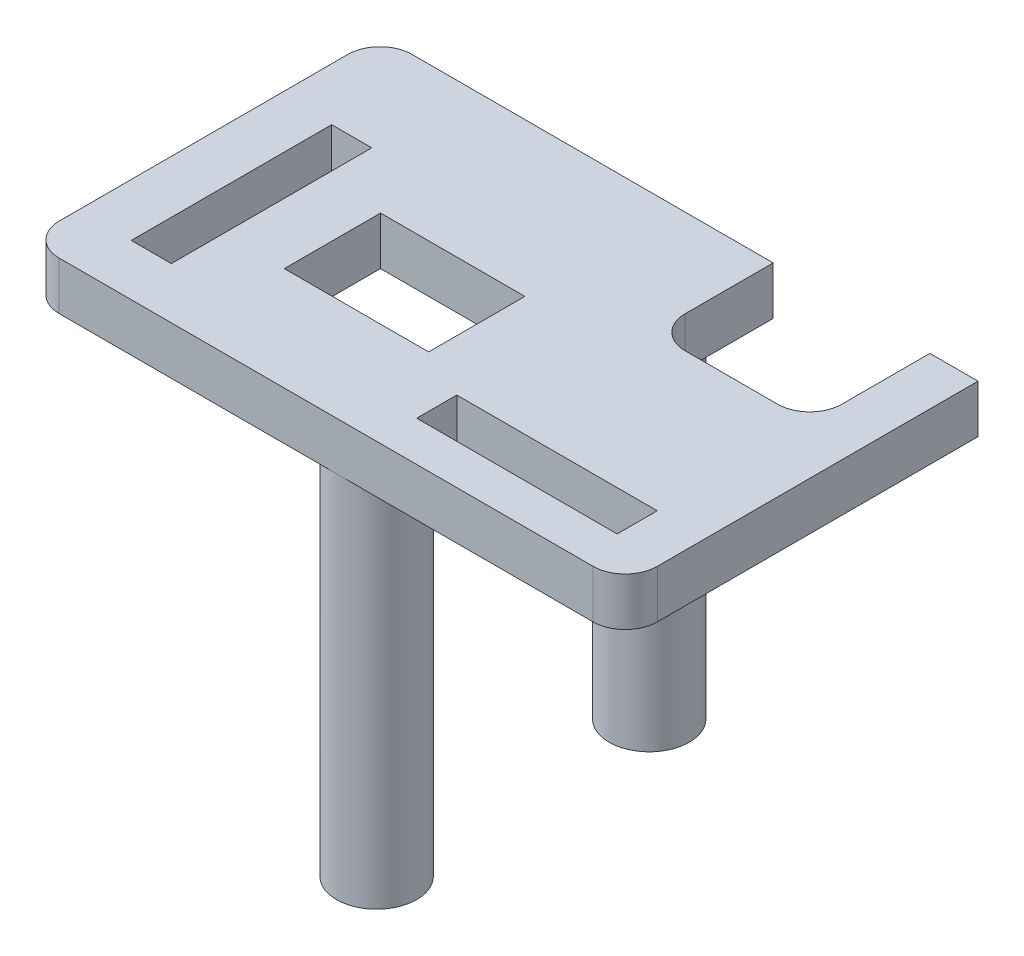
ISO-10303-21;
HEADER;
FILE_DESCRIPTION(('STEP AP214'),'2;1');
FILE_NAME('part.step','',(''),(''),'','','');
FILE_SCHEMA(('AUTOMOTIVE_DESIGN { 1 0 10303 214 1 1 1 1 }'));
ENDSEC;
DATA;
#1=APPLICATION_CONTEXT('core data for automotive mechanical design processes');
#2=APPLICATION_PROTOCOL_DEFINITION('international standard','automotive_design',2000,#1);
#3=PRODUCT_CONTEXT('',#1,'mechanical');
#4=PRODUCT('Part','Part','',(#3));
#5=PRODUCT_RELATED_PRODUCT_CATEGORY('part','',(#4));
#6=PRODUCT_DEFINITION_FORMATION('','',#4);
#7=PRODUCT_DEFINITION_CONTEXT('part definition',#1,'design');
#8=PRODUCT_DEFINITION('design','',#6,#7);
#9=PRODUCT_DEFINITION_SHAPE('','',#8);
#10=(LENGTH_UNIT() NAMED_UNIT(*) SI_UNIT(.MILLI.,.METRE.));
#11=(NAMED_UNIT(*) PLANE_ANGLE_UNIT() SI_UNIT($,.RADIAN.));
#12=(NAMED_UNIT(*) SI_UNIT($,.STERADIAN.) SOLID_ANGLE_UNIT());
#13=UNCERTAINTY_MEASURE_WITH_UNIT(LENGTH_MEASURE(1.E-05),#10,'distance_accuracy_value','');
#14=(GEOMETRIC_REPRESENTATION_CONTEXT(3) GLOBAL_UNCERTAINTY_ASSIGNED_CONTEXT((#13)) GLOBAL_UNIT_ASSIGNED_CONTEXT((#10,
#11,#12)) REPRESENTATION_CONTEXT('',''));
#15=CARTESIAN_POINT('',(0.,0.,0.));
#16=DIRECTION('',(0.,0.,1.));
#17=DIRECTION('',(1.,0.,0.));
#18=AXIS2_PLACEMENT_3D('',#15,#16,#17);
#19=CARTESIAN_POINT('',(-19.9759075065072,3.,0.));
#20=DIRECTION('',(-1.,0.,0.));
#21=DIRECTION('',(0.,0.,1.));
#22=AXIS2_PLACEMENT_3D('',#19,#20,#21);
#23=PLANE('',#22);
#24=DIRECTION('',(0.,0.,-1.));
#25=VECTOR('',#24,1.);
#26=CARTESIAN_POINT('',(-19.9759075065072,0.,0.));
#27=LINE('',#26,#25);
#28=CARTESIAN_POINT('',(-19.9759075065072,0.,28.1900374848538));
#29=VERTEX_POINT('',#28);
#30=CARTESIAN_POINT('',(-19.9759075065072,0.,22.1900374848537));
#31=VERTEX_POINT('',#30);
#32=EDGE_CURVE('E287',#29,#31,#27,.T.);
#33=ORIENTED_EDGE('',*,*,#32,.F.);
#34=DIRECTION('',(0.,-1.,0.));
#35=VECTOR('',#34,1.);
#36=CARTESIAN_POINT('',(-19.9759075065072,3.,28.1900374848538));
#37=LINE('',#36,#35);
#38=CARTESIAN_POINT('',(-19.9759075065072,3.,28.1900374848538));
#39=VERTEX_POINT('',#38);
#40=EDGE_CURVE('E308',#39,#29,#37,.T.);
#41=ORIENTED_EDGE('',*,*,#40,.F.);
#42=DIRECTION('',(0.,0.,-1.));
#43=VECTOR('',#42,1.);
#44=CARTESIAN_POINT('',(-19.9759075065072,3.,0.));
#45=LINE('',#44,#43);
#46=CARTESIAN_POINT('',(-19.9759075065072,3.,22.1900374848537));
#47=VERTEX_POINT('',#46);
#48=EDGE_CURVE('E450',#39,#47,#45,.T.);
#49=ORIENTED_EDGE('',*,*,#48,.T.);
#50=DIRECTION('',(0.,-1.,0.));
#51=VECTOR('',#50,1.);
#52=CARTESIAN_POINT('',(-19.9759075065072,3.,22.1900374848537));
#53=LINE('',#52,#51);
#54=EDGE_CURVE('E300',#47,#31,#53,.T.);
#55=ORIENTED_EDGE('',*,*,#54,.T.);
#56=EDGE_LOOP('',(#33,#41,#49,#55));
#57=FACE_BOUND('',#56,.T.);
#58=ADVANCED_FACE('F34',(#57),#23,.T.);
#59=CARTESIAN_POINT('',(0.,3.,28.1900374848538));
#60=DIRECTION('',(0.,0.,-1.));
#61=DIRECTION('',(-1.,0.,0.));
#62=AXIS2_PLACEMENT_3D('',#59,#60,#61);
#63=PLANE('',#62);
#64=DIRECTION('',(1.,0.,0.));
#65=VECTOR('',#64,1.);
#66=CARTESIAN_POINT('',(0.,0.,28.1900374848538));
#67=LINE('',#66,#65);
#68=CARTESIAN_POINT('',(-28.9759075065072,0.,28.1900374848537));
#69=VERTEX_POINT('',#68);
#70=EDGE_CURVE('E290',#69,#29,#67,.T.);
#71=ORIENTED_EDGE('',*,*,#70,.F.);
#72=DIRECTION('',(0.,-1.,0.));
#73=VECTOR('',#72,1.);
#74=CARTESIAN_POINT('',(-28.9759075065072,3.,28.1900374848537));
#75=LINE('',#74,#73);
#76=CARTESIAN_POINT('',(-28.9759075065072,3.,28.1900374848537));
#77=VERTEX_POINT('',#76);
#78=EDGE_CURVE('E306',#77,#69,#75,.T.);
#79=ORIENTED_EDGE('',*,*,#78,.F.);
#80=DIRECTION('',(1.,0.,0.));
#81=VECTOR('',#80,1.);
#82=CARTESIAN_POINT('',(0.,3.,28.1900374848538));
#83=LINE('',#82,#81);
#84=EDGE_CURVE('E453',#77,#39,#83,.T.);
#85=ORIENTED_EDGE('',*,*,#84,.T.);
#86=ORIENTED_EDGE('',*,*,#40,.T.);
#87=EDGE_LOOP('',(#71,#79,#85,#86));
#88=FACE_BOUND('',#87,.T.);
#89=ADVANCED_FACE('F469',(#88),#63,.T.);
#90=CARTESIAN_POINT('',(-28.9759075065072,3.,0.));
#91=DIRECTION('',(-1.,0.,0.));
#92=DIRECTION('',(0.,0.,1.));
#93=AXIS2_PLACEMENT_3D('',#90,#91,#92);
#94=PLANE('',#93);
#95=DIRECTION('',(0.,0.,-1.));
#96=VECTOR('',#95,1.);
#97=CARTESIAN_POINT('',(-28.9759075065072,0.,0.));
#98=LINE('',#97,#96);
#99=CARTESIAN_POINT('',(-28.9759075065072,0.,22.1900374848537));
#100=VERTEX_POINT('',#99);
#101=EDGE_CURVE('E293',#69,#100,#98,.T.);
#102=ORIENTED_EDGE('',*,*,#101,.T.);
#103=DIRECTION('',(0.,-1.,0.));
#104=VECTOR('',#103,1.);
#105=CARTESIAN_POINT('',(-28.9759075065072,3.,22.1900374848537));
#106=LINE('',#105,#104);
#107=CARTESIAN_POINT('',(-28.9759075065072,3.,22.1900374848537));
#108=VERTEX_POINT('',#107);
#109=EDGE_CURVE('E302',#108,#100,#106,.T.);
#110=ORIENTED_EDGE('',*,*,#109,.F.);
#111=DIRECTION('',(0.,0.,-1.));
#112=VECTOR('',#111,1.);
#113=CARTESIAN_POINT('',(-28.9759075065072,3.,0.));
#114=LINE('',#113,#112);
#115=EDGE_CURVE('E455',#77,#108,#114,.T.);
#116=ORIENTED_EDGE('',*,*,#115,.F.);
#117=ORIENTED_EDGE('',*,*,#78,.T.);
#118=EDGE_LOOP('',(#102,#110,#116,#117));
#119=FACE_BOUND('',#118,.T.);
#120=ADVANCED_FACE('F472',(#119),#94,.F.);
#121=CARTESIAN_POINT('',(0.,3.,18.9400374848537));
#122=DIRECTION('',(0.,0.,-1.));
#123=DIRECTION('',(-1.,0.,0.));
#124=AXIS2_PLACEMENT_3D('',#121,#122,#123);
#125=PLANE('',#124);
#126=DIRECTION('',(1.,0.,0.));
#127=VECTOR('',#126,1.);
#128=CARTESIAN_POINT('',(0.,0.,18.9400374848537));
#129=LINE('',#128,#127);
#130=CARTESIAN_POINT('',(-35.2702207310731,0.,18.9400374848537));
#131=VERTEX_POINT('',#130);
#132=CARTESIAN_POINT('',(-32.7702207310731,0.,18.9400374848537));
#133=VERTEX_POINT('',#132);
#134=EDGE_CURVE('E275',#131,#133,#129,.T.);
#135=ORIENTED_EDGE('',*,*,#134,.T.);
#136=DIRECTION('',(0.,-1.,0.));
#137=VECTOR('',#136,1.);
#138=CARTESIAN_POINT('',(-32.7702207310731,3.,18.9400374848537));
#139=LINE('',#138,#137);
#140=CARTESIAN_POINT('',(-32.7702207310731,3.,18.9400374848537));
#141=VERTEX_POINT('',#140);
#142=EDGE_CURVE('E303',#141,#133,#139,.T.);
#143=ORIENTED_EDGE('',*,*,#142,.F.);
#144=DIRECTION('',(1.,0.,0.));
#145=VECTOR('',#144,1.);
#146=CARTESIAN_POINT('',(0.,3.,18.9400374848537));
#147=LINE('',#146,#145);
#148=CARTESIAN_POINT('',(-35.2702207310731,3.,18.9400374848537));
#149=VERTEX_POINT('',#148);
#150=EDGE_CURVE('E389',#149,#141,#147,.T.);
#151=ORIENTED_EDGE('',*,*,#150,.F.);
#152=DIRECTION('',(0.,-1.,0.));
#153=VECTOR('',#152,1.);
#154=CARTESIAN_POINT('',(-35.2702207310731,3.,18.9400374848537));
#155=LINE('',#154,#153);
#156=EDGE_CURVE('E311',#149,#131,#155,.T.);
#157=ORIENTED_EDGE('',*,*,#156,.T.);
#158=EDGE_LOOP('',(#135,#143,#151,#157));
#159=FACE_BOUND('',#158,.T.);
#160=ADVANCED_FACE('F505',(#159),#125,.F.);
#161=CARTESIAN_POINT('',(-32.7702207310731,3.,0.));
#162=DIRECTION('',(1.,0.,0.));
#163=DIRECTION('',(0.,0.,-1.));
#164=AXIS2_PLACEMENT_3D('',#161,#162,#163);
#165=PLANE('',#164);
#166=DIRECTION('',(0.,0.,1.));
#167=VECTOR('',#166,1.);
#168=CARTESIAN_POINT('',(-32.7702207310731,0.,0.));
#169=LINE('',#168,#167);
#170=CARTESIAN_POINT('',(-32.7702207310731,0.,31.4400374848537));
#171=VERTEX_POINT('',#170);
#172=EDGE_CURVE('E278',#133,#171,#169,.T.);
#173=ORIENTED_EDGE('',*,*,#172,.T.);
#174=DIRECTION('',(0.,-1.,0.));
#175=VECTOR('',#174,1.);
#176=CARTESIAN_POINT('',(-32.7702207310731,3.,31.4400374848537));
#177=LINE('',#176,#175);
#178=CARTESIAN_POINT('',(-32.7702207310731,3.,31.4400374848537));
#179=VERTEX_POINT('',#178);
#180=EDGE_CURVE('E316',#179,#171,#177,.T.);
#181=ORIENTED_EDGE('',*,*,#180,.F.);
#182=DIRECTION('',(0.,0.,1.));
#183=VECTOR('',#182,1.);
#184=CARTESIAN_POINT('',(-32.7702207310731,3.,0.));
#185=LINE('',#184,#183);
#186=EDGE_CURVE('E442',#141,#179,#185,.T.);
#187=ORIENTED_EDGE('',*,*,#186,.F.);
#188=ORIENTED_EDGE('',*,*,#142,.T.);
#189=EDGE_LOOP('',(#173,#181,#187,#188));
#190=FACE_BOUND('',#189,.T.);
#191=ADVANCED_FACE('F501',(#190),#165,.F.);
#192=CARTESIAN_POINT('',(0.,3.,31.4400374848537));
#193=DIRECTION('',(0.,0.,-1.));
#194=DIRECTION('',(-1.,0.,0.));
#195=AXIS2_PLACEMENT_3D('',#192,#193,#194);
#196=PLANE('',#195);
#197=DIRECTION('',(1.,0.,0.));
#198=VECTOR('',#197,1.);
#199=CARTESIAN_POINT('',(0.,0.,31.4400374848537));
#200=LINE('',#199,#198);
#201=CARTESIAN_POINT('',(-35.2702207310731,0.,31.4400374848537));
#202=VERTEX_POINT('',#201);
#203=EDGE_CURVE('E281',#202,#171,#200,.T.);
#204=ORIENTED_EDGE('',*,*,#203,.F.);
#205=DIRECTION('',(0.,-1.,0.));
#206=VECTOR('',#205,1.);
#207=CARTESIAN_POINT('',(-35.2702207310731,3.,31.4400374848537));
#208=LINE('',#207,#206);
#209=CARTESIAN_POINT('',(-35.2702207310731,3.,31.4400374848537));
#210=VERTEX_POINT('',#209);
#211=EDGE_CURVE('E313',#210,#202,#208,.T.);
#212=ORIENTED_EDGE('',*,*,#211,.F.);
#213=DIRECTION('',(1.,0.,0.));
#214=VECTOR('',#213,1.);
#215=CARTESIAN_POINT('',(0.,3.,31.4400374848537));
#216=LINE('',#215,#214);
#217=EDGE_CURVE('E444',#210,#179,#216,.T.);
#218=ORIENTED_EDGE('',*,*,#217,.T.);
#219=ORIENTED_EDGE('',*,*,#180,.T.);
#220=EDGE_LOOP('',(#204,#212,#218,#219));
#221=FACE_BOUND('',#220,.T.);
#222=ADVANCED_FACE('F497',(#221),#196,.T.);
#223=CARTESIAN_POINT('',(0.,3.,12.6400374848537));
#224=DIRECTION('',(0.,0.,-1.));
#225=DIRECTION('',(-1.,0.,0.));
#226=AXIS2_PLACEMENT_3D('',#223,#224,#225);
#227=PLANE('',#226);
#228=DIRECTION('',(1.,0.,0.));
#229=VECTOR('',#228,1.);
#230=CARTESIAN_POINT('',(0.,0.,12.6400374848537));
#231=LINE('',#230,#229);
#232=CARTESIAN_POINT('',(-36.561763485987,0.,12.6400374848537));
#233=VERTEX_POINT('',#232);
#234=CARTESIAN_POINT('',(-19.2702207310731,0.,12.6400374848537));
#235=VERTEX_POINT('',#234);
#236=EDGE_CURVE('E253',#233,#235,#231,.T.);
#237=ORIENTED_EDGE('',*,*,#236,.F.);
#238=DIRECTION('',(0.,-1.,0.));
#239=VECTOR('',#238,1.);
#240=CARTESIAN_POINT('',(-36.561763485987,3.,12.6400374848537));
#241=LINE('',#240,#239);
#242=CARTESIAN_POINT('',(-36.561763485987,3.,12.6400374848537));
#243=VERTEX_POINT('',#242);
#244=EDGE_CURVE('E350',#233,#243,#241,.F.);
#245=ORIENTED_EDGE('',*,*,#244,.T.);
#246=DIRECTION('',(1.,0.,0.));
#247=VECTOR('',#246,1.);
#248=CARTESIAN_POINT('',(0.,3.,12.6400374848537));
#249=LINE('',#248,#247);
#250=CARTESIAN_POINT('',(-14.0414444487504,3.,12.6400374848537));
#251=VERTEX_POINT('',#250);
#252=EDGE_CURVE('E433',#243,#251,#249,.T.);
#253=ORIENTED_EDGE('',*,*,#252,.T.);
#254=DIRECTION('',(0.,-1.,0.));
#255=VECTOR('',#254,1.);
#256=CARTESIAN_POINT('',(-14.0414444487504,3.,12.6400374848537));
#257=LINE('',#256,#255);
#258=CARTESIAN_POINT('',(-14.0414444487504,0.,12.6400374848537));
#259=VERTEX_POINT('',#258);
#260=EDGE_CURVE('E232',#251,#259,#257,.T.);
#261=ORIENTED_EDGE('',*,*,#260,.T.);
#262=EDGE_CURVE('E252',#235,#259,#231,.T.);
#263=ORIENTED_EDGE('',*,*,#262,.F.);
#264=EDGE_LOOP('',(#237,#245,#253,#261,#263));
#265=FACE_BOUND('',#264,.T.);
#266=ADVANCED_FACE('F500',(#265),#227,.T.);
#267=CARTESIAN_POINT('',(-38.561763485987,3.,0.));
#268=DIRECTION('',(1.,0.,0.));
#269=DIRECTION('',(0.,0.,-1.));
#270=AXIS2_PLACEMENT_3D('',#267,#268,#269);
#271=PLANE('',#270);
#272=DIRECTION('',(0.,0.,1.));
#273=VECTOR('',#272,1.);
#274=CARTESIAN_POINT('',(-38.561763485987,3.,0.));
#275=LINE('',#274,#273);
#276=CARTESIAN_POINT('',(-38.561763485987,3.,14.6400374848537));
#277=VERTEX_POINT('',#276);
#278=CARTESIAN_POINT('',(-38.561763485987,3.,32.6400374848537));
#279=VERTEX_POINT('',#278);
#280=EDGE_CURVE('E429',#277,#279,#275,.T.);
#281=ORIENTED_EDGE('',*,*,#280,.F.);
#282=DIRECTION('',(0.,-1.,0.));
#283=VECTOR('',#282,1.);
#284=CARTESIAN_POINT('',(-38.561763485987,0.,14.6400374848537));
#285=LINE('',#284,#283);
#286=CARTESIAN_POINT('',(-38.561763485987,0.,14.6400374848537));
#287=VERTEX_POINT('',#286);
#288=EDGE_CURVE('E341',#277,#287,#285,.T.);
#289=ORIENTED_EDGE('',*,*,#288,.T.);
#290=DIRECTION('',(0.,0.,1.));
#291=VECTOR('',#290,1.);
#292=CARTESIAN_POINT('',(-38.561763485987,0.,0.));
#293=LINE('',#292,#291);
#294=CARTESIAN_POINT('',(-38.561763485987,0.,32.6400374848537));
#295=VERTEX_POINT('',#294);
#296=EDGE_CURVE('E256',#287,#295,#293,.T.);
#297=ORIENTED_EDGE('',*,*,#296,.T.);
#298=DIRECTION('',(0.,-1.,0.));
#299=VECTOR('',#298,1.);
#300=CARTESIAN_POINT('',(-38.561763485987,3.,32.6400374848537));
#301=LINE('',#300,#299);
#302=EDGE_CURVE('E339',#295,#279,#301,.F.);
#303=ORIENTED_EDGE('',*,*,#302,.T.);
#304=EDGE_LOOP('',(#281,#289,#297,#303));
#305=FACE_BOUND('',#304,.T.);
#306=ADVANCED_FACE('F523',(#305),#271,.F.);
#307=CARTESIAN_POINT('',(0.,3.,34.6400374848537));
#308=DIRECTION('',(0.,0.,-1.));
#309=DIRECTION('',(-1.,0.,0.));
#310=AXIS2_PLACEMENT_3D('',#307,#308,#309);
#311=PLANE('',#310);
#312=DIRECTION('',(1.,0.,0.));
#313=VECTOR('',#312,1.);
#314=CARTESIAN_POINT('',(0.,3.,34.6400374848537));
#315=LINE('',#314,#313);
#316=CARTESIAN_POINT('',(-36.561763485987,3.,34.6400374848537));
#317=VERTEX_POINT('',#316);
#318=CARTESIAN_POINT('',(-3.2702207310731,3.,34.6400374848537));
#319=VERTEX_POINT('',#318);
#320=EDGE_CURVE('E425',#317,#319,#315,.T.);
#321=ORIENTED_EDGE('',*,*,#320,.F.);
#322=DIRECTION('',(0.,-1.,0.));
#323=VECTOR('',#322,1.);
#324=CARTESIAN_POINT('',(-36.561763485987,3.,34.6400374848537));
#325=LINE('',#324,#323);
#326=CARTESIAN_POINT('',(-36.561763485987,0.,34.6400374848537));
#327=VERTEX_POINT('',#326);
#328=EDGE_CURVE('E360',#317,#327,#325,.T.);
#329=ORIENTED_EDGE('',*,*,#328,.T.);
#330=DIRECTION('',(1.,0.,0.));
#331=VECTOR('',#330,1.);
#332=CARTESIAN_POINT('',(0.,0.,34.6400374848537));
#333=LINE('',#332,#331);
#334=CARTESIAN_POINT('',(-19.2702207310731,0.,34.6400374848537));
#335=VERTEX_POINT('',#334);
#336=EDGE_CURVE('E259',#327,#335,#333,.T.);
#337=ORIENTED_EDGE('',*,*,#336,.T.);
#338=CARTESIAN_POINT('',(-3.2702207310731,0.,34.6400374848537));
#339=VERTEX_POINT('',#338);
#340=EDGE_CURVE('E216',#335,#339,#333,.T.);
#341=ORIENTED_EDGE('',*,*,#340,.T.);
#342=DIRECTION('',(0.,-1.,0.));
#343=VECTOR('',#342,1.);
#344=CARTESIAN_POINT('',(-3.2702207310731,3.,34.6400374848537));
#345=LINE('',#344,#343);
#346=EDGE_CURVE('E358',#339,#319,#345,.F.);
#347=ORIENTED_EDGE('',*,*,#346,.T.);
#348=EDGE_LOOP('',(#321,#329,#337,#341,#347));
#349=FACE_BOUND('',#348,.T.);
#350=ADVANCED_FACE('F424',(#349),#311,.F.);
#351=CARTESIAN_POINT('',(-1.2702207310731,3.,0.));
#352=DIRECTION('',(1.,0.,0.));
#353=DIRECTION('',(0.,0.,-1.));
#354=AXIS2_PLACEMENT_3D('',#351,#352,#353);
#355=PLANE('',#354);
#356=DIRECTION('',(0.,0.,1.));
#357=VECTOR('',#356,1.);
#358=CARTESIAN_POINT('',(-1.2702207310731,3.,0.));
#359=LINE('',#358,#357);
#360=CARTESIAN_POINT('',(-1.2702207310731,3.,12.6400374848537));
#361=VERTEX_POINT('',#360);
#362=CARTESIAN_POINT('',(-1.2702207310731,3.,32.6400374848537));
#363=VERTEX_POINT('',#362);
#364=EDGE_CURVE('E418',#361,#363,#359,.T.);
#365=ORIENTED_EDGE('',*,*,#364,.T.);
#366=DIRECTION('',(0.,-1.,0.));
#367=VECTOR('',#366,1.);
#368=CARTESIAN_POINT('',(-1.2702207310731,0.,32.6400374848537));
#369=LINE('',#368,#367);
#370=CARTESIAN_POINT('',(-1.2702207310731,0.,32.6400374848537));
#371=VERTEX_POINT('',#370);
#372=EDGE_CURVE('E363',#363,#371,#369,.T.);
#373=ORIENTED_EDGE('',*,*,#372,.T.);
#374=DIRECTION('',(0.,0.,1.));
#375=VECTOR('',#374,1.);
#376=CARTESIAN_POINT('',(-1.2702207310731,0.,0.));
#377=LINE('',#376,#375);
#378=CARTESIAN_POINT('',(-1.2702207310731,0.,12.6400374848537));
#379=VERTEX_POINT('',#378);
#380=EDGE_CURVE('E261',#379,#371,#377,.T.);
#381=ORIENTED_EDGE('',*,*,#380,.F.);
#382=DIRECTION('',(0.,-1.,0.));
#383=VECTOR('',#382,1.);
#384=CARTESIAN_POINT('',(-1.2702207310731,3.,12.6400374848537));
#385=LINE('',#384,#383);
#386=EDGE_CURVE('E314',#361,#379,#385,.T.);
#387=ORIENTED_EDGE('',*,*,#386,.F.);
#388=EDGE_LOOP('',(#365,#373,#381,#387));
#389=FACE_BOUND('',#388,.T.);
#390=ADVANCED_FACE('F415',(#389),#355,.T.);
#391=CARTESIAN_POINT('',(0.,3.,12.6400374848537));
#392=DIRECTION('',(0.,0.,-1.));
#393=DIRECTION('',(-1.,0.,0.));
#394=AXIS2_PLACEMENT_3D('',#391,#392,#393);
#395=PLANE('',#394);
#396=DIRECTION('',(1.,0.,0.));
#397=VECTOR('',#396,1.);
#398=CARTESIAN_POINT('',(0.,0.,12.6400374848537));
#399=LINE('',#398,#397);
#400=CARTESIAN_POINT('',(-4.2702207310731,0.,12.6400374848537));
#401=VERTEX_POINT('',#400);
#402=EDGE_CURVE('E264',#401,#379,#399,.T.);
#403=ORIENTED_EDGE('',*,*,#402,.F.);
#404=DIRECTION('',(0.,-1.,0.));
#405=VECTOR('',#404,1.);
#406=CARTESIAN_POINT('',(-4.2702207310731,3.,12.6400374848537));
#407=LINE('',#406,#405);
#408=CARTESIAN_POINT('',(-4.2702207310731,3.,12.6400374848537));
#409=VERTEX_POINT('',#408);
#410=EDGE_CURVE('E322',#409,#401,#407,.T.);
#411=ORIENTED_EDGE('',*,*,#410,.F.);
#412=DIRECTION('',(1.,0.,0.));
#413=VECTOR('',#412,1.);
#414=CARTESIAN_POINT('',(0.,3.,12.6400374848537));
#415=LINE('',#414,#413);
#416=EDGE_CURVE('E431',#409,#361,#415,.T.);
#417=ORIENTED_EDGE('',*,*,#416,.T.);
#418=ORIENTED_EDGE('',*,*,#386,.T.);
#419=EDGE_LOOP('',(#403,#411,#417,#418));
#420=FACE_BOUND('',#419,.T.);
#421=ADVANCED_FACE('F410',(#420),#395,.T.);
#422=CARTESIAN_POINT('',(-4.2702207310731,3.,0.));
#423=DIRECTION('',(-1.,0.,0.));
#424=DIRECTION('',(0.,0.,1.));
#425=AXIS2_PLACEMENT_3D('',#422,#423,#424);
#426=PLANE('',#425);
#427=DIRECTION('',(0.,0.,-1.));
#428=VECTOR('',#427,1.);
#429=CARTESIAN_POINT('',(-4.2702207310731,0.,0.));
#430=LINE('',#429,#428);
#431=CARTESIAN_POINT('',(-4.2702207310731,0.,18.1314427198825));
#432=VERTEX_POINT('',#431);
#433=EDGE_CURVE('E267',#432,#401,#430,.T.);
#434=ORIENTED_EDGE('',*,*,#433,.F.);
#435=DIRECTION('',(0.,-1.,0.));
#436=VECTOR('',#435,1.);
#437=CARTESIAN_POINT('',(-4.2702207310731,3.,18.1314427198825));
#438=LINE('',#437,#436);
#439=CARTESIAN_POINT('',(-4.2702207310731,3.,18.1314427198825));
#440=VERTEX_POINT('',#439);
#441=EDGE_CURVE('E334',#432,#440,#438,.F.);
#442=ORIENTED_EDGE('',*,*,#441,.T.);
#443=DIRECTION('',(0.,0.,-1.));
#444=VECTOR('',#443,1.);
#445=CARTESIAN_POINT('',(-4.2702207310731,3.,0.));
#446=LINE('',#445,#444);
#447=EDGE_CURVE('E406',#440,#409,#446,.T.);
#448=ORIENTED_EDGE('',*,*,#447,.T.);
#449=ORIENTED_EDGE('',*,*,#410,.T.);
#450=EDGE_LOOP('',(#434,#442,#448,#449));
#451=FACE_BOUND('',#450,.T.);
#452=ADVANCED_FACE('F402',(#451),#426,.T.);
#453=CARTESIAN_POINT('',(0.,3.,20.1314427198825));
#454=DIRECTION('',(0.,0.,1.));
#455=DIRECTION('',(1.,0.,0.));
#456=AXIS2_PLACEMENT_3D('',#453,#454,#455);
#457=PLANE('',#456);
#458=DIRECTION('',(-1.,0.,0.));
#459=VECTOR('',#458,1.);
#460=CARTESIAN_POINT('',(0.,3.,20.1314427198825));
#461=LINE('',#460,#459);
#462=CARTESIAN_POINT('',(-6.2702207310731,3.,20.1314427198825));
#463=VERTEX_POINT('',#462);
#464=CARTESIAN_POINT('',(-12.0414444487504,3.,20.1314427198825));
#465=VERTEX_POINT('',#464);
#466=EDGE_CURVE('E381',#463,#465,#461,.T.);
#467=ORIENTED_EDGE('',*,*,#466,.F.);
#468=DIRECTION('',(0.,-1.,0.));
#469=VECTOR('',#468,1.);
#470=CARTESIAN_POINT('',(-6.2702207310731,3.,20.1314427198825));
#471=LINE('',#470,#469);
#472=CARTESIAN_POINT('',(-6.2702207310731,0.,20.1314427198825));
#473=VERTEX_POINT('',#472);
#474=EDGE_CURVE('E331',#463,#473,#471,.T.);
#475=ORIENTED_EDGE('',*,*,#474,.T.);
#476=DIRECTION('',(-1.,0.,0.));
#477=VECTOR('',#476,1.);
#478=CARTESIAN_POINT('',(0.,0.,20.1314427198825));
#479=LINE('',#478,#477);
#480=CARTESIAN_POINT('',(-12.0414444487504,0.,20.1314427198825));
#481=VERTEX_POINT('',#480);
#482=EDGE_CURVE('E269',#473,#481,#479,.T.);
#483=ORIENTED_EDGE('',*,*,#482,.T.);
#484=DIRECTION('',(0.,-1.,0.));
#485=VECTOR('',#484,1.);
#486=CARTESIAN_POINT('',(-12.0414444487504,3.,20.1314427198825));
#487=LINE('',#486,#485);
#488=EDGE_CURVE('E310',#481,#465,#487,.F.);
#489=ORIENTED_EDGE('',*,*,#488,.T.);
#490=EDGE_LOOP('',(#467,#475,#483,#489));
#491=FACE_BOUND('',#490,.T.);
#492=ADVANCED_FACE('F394',(#491),#457,.F.);
#493=CARTESIAN_POINT('',(0.,3.,32.1400374848537));
#494=DIRECTION('',(0.,0.,-1.));
#495=DIRECTION('',(-1.,0.,0.));
#496=AXIS2_PLACEMENT_3D('',#493,#494,#495);
#497=PLANE('',#496);
#498=DIRECTION('',(1.,0.,0.));
#499=VECTOR('',#498,1.);
#500=CARTESIAN_POINT('',(0.,0.,32.1400374848537));
#501=LINE('',#500,#499);
#502=CARTESIAN_POINT('',(-16.7702207310731,0.,32.1400374848537));
#503=VERTEX_POINT('',#502);
#504=CARTESIAN_POINT('',(-4.2702207310731,0.,32.1400374848537));
#505=VERTEX_POINT('',#504);
#506=EDGE_CURVE('E213',#503,#505,#501,.T.);
#507=ORIENTED_EDGE('',*,*,#506,.F.);
#508=DIRECTION('',(0.,-1.,0.));
#509=VECTOR('',#508,1.);
#510=CARTESIAN_POINT('',(-16.7702207310731,3.,32.1400374848537));
#511=LINE('',#510,#509);
#512=CARTESIAN_POINT('',(-16.7702207310731,3.,32.1400374848537));
#513=VERTEX_POINT('',#512);
#514=EDGE_CURVE('E223',#513,#503,#511,.T.);
#515=ORIENTED_EDGE('',*,*,#514,.F.);
#516=DIRECTION('',(1.,0.,0.));
#517=VECTOR('',#516,1.);
#518=CARTESIAN_POINT('',(0.,3.,32.1400374848537));
#519=LINE('',#518,#517);
#520=CARTESIAN_POINT('',(-4.2702207310731,3.,32.1400374848537));
#521=VERTEX_POINT('',#520);
#522=EDGE_CURVE('E299',#513,#521,#519,.T.);
#523=ORIENTED_EDGE('',*,*,#522,.T.);
#524=DIRECTION('',(0.,-1.,0.));
#525=VECTOR('',#524,1.);
#526=CARTESIAN_POINT('',(-4.2702207310731,3.,32.1400374848537));
#527=LINE('',#526,#525);
#528=EDGE_CURVE('E240',#521,#505,#527,.T.);
#529=ORIENTED_EDGE('',*,*,#528,.T.);
#530=EDGE_LOOP('',(#507,#515,#523,#529));
#531=FACE_BOUND('',#530,.T.);
#532=ADVANCED_FACE('F239',(#531),#497,.T.);
#533=CARTESIAN_POINT('',(-16.7702207310731,3.,0.));
#534=DIRECTION('',(-1.,0.,0.));
#535=DIRECTION('',(0.,0.,1.));
#536=AXIS2_PLACEMENT_3D('',#533,#534,#535);
#537=PLANE('',#536);
#538=DIRECTION('',(0.,0.,-1.));
#539=VECTOR('',#538,1.);
#540=CARTESIAN_POINT('',(-16.7702207310731,0.,0.));
#541=LINE('',#540,#539);
#542=CARTESIAN_POINT('',(-16.7702207310731,0.,29.6400374848537));
#543=VERTEX_POINT('',#542);
#544=EDGE_CURVE('E226',#503,#543,#541,.T.);
#545=ORIENTED_EDGE('',*,*,#544,.T.);
#546=DIRECTION('',(0.,-1.,0.));
#547=VECTOR('',#546,1.);
#548=CARTESIAN_POINT('',(-16.7702207310731,3.,29.6400374848537));
#549=LINE('',#548,#547);
#550=CARTESIAN_POINT('',(-16.7702207310731,3.,29.6400374848537));
#551=VERTEX_POINT('',#550);
#552=EDGE_CURVE('E233',#551,#543,#549,.T.);
#553=ORIENTED_EDGE('',*,*,#552,.F.);
#554=DIRECTION('',(0.,0.,-1.));
#555=VECTOR('',#554,1.);
#556=CARTESIAN_POINT('',(-16.7702207310731,3.,0.));
#557=LINE('',#556,#555);
#558=EDGE_CURVE('E228',#513,#551,#557,.T.);
#559=ORIENTED_EDGE('',*,*,#558,.F.);
#560=ORIENTED_EDGE('',*,*,#514,.T.);
#561=EDGE_LOOP('',(#545,#553,#559,#560));
#562=FACE_BOUND('',#561,.T.);
#563=ADVANCED_FACE('F224',(#562),#537,.F.);
#564=CARTESIAN_POINT('',(0.,3.,29.6400374848537));
#565=DIRECTION('',(0.,0.,-1.));
#566=DIRECTION('',(-1.,0.,0.));
#567=AXIS2_PLACEMENT_3D('',#564,#565,#566);
#568=PLANE('',#567);
#569=DIRECTION('',(1.,0.,0.));
#570=VECTOR('',#569,1.);
#571=CARTESIAN_POINT('',(0.,0.,29.6400374848537));
#572=LINE('',#571,#570);
#573=CARTESIAN_POINT('',(-4.2702207310731,0.,29.6400374848537));
#574=VERTEX_POINT('',#573);
#575=EDGE_CURVE('E237',#543,#574,#572,.T.);
#576=ORIENTED_EDGE('',*,*,#575,.T.);
#577=DIRECTION('',(0.,-1.,0.));
#578=VECTOR('',#577,1.);
#579=CARTESIAN_POINT('',(-4.2702207310731,3.,29.6400374848537));
#580=LINE('',#579,#578);
#581=CARTESIAN_POINT('',(-4.2702207310731,3.,29.6400374848537));
#582=VERTEX_POINT('',#581);
#583=EDGE_CURVE('E327',#582,#574,#580,.T.);
#584=ORIENTED_EDGE('',*,*,#583,.F.);
#585=DIRECTION('',(1.,0.,0.));
#586=VECTOR('',#585,1.);
#587=CARTESIAN_POINT('',(0.,3.,29.6400374848537));
#588=LINE('',#587,#586);
#589=EDGE_CURVE('E566',#551,#582,#588,.T.);
#590=ORIENTED_EDGE('',*,*,#589,.F.);
#591=ORIENTED_EDGE('',*,*,#552,.T.);
#592=EDGE_LOOP('',(#576,#584,#590,#591));
#593=FACE_BOUND('',#592,.T.);
#594=ADVANCED_FACE('F495',(#593),#568,.F.);
#595=CARTESIAN_POINT('',(-35.2702207310731,3.,0.));
#596=DIRECTION('',(1.,0.,0.));
#597=DIRECTION('',(0.,0.,-1.));
#598=AXIS2_PLACEMENT_3D('',#595,#596,#597);
#599=PLANE('',#598);
#600=DIRECTION('',(0.,0.,1.));
#601=VECTOR('',#600,1.);
#602=CARTESIAN_POINT('',(-35.2702207310731,0.,0.));
#603=LINE('',#602,#601);
#604=EDGE_CURVE('E284',#131,#202,#603,.T.);
#605=ORIENTED_EDGE('',*,*,#604,.F.);
#606=ORIENTED_EDGE('',*,*,#156,.F.);
#607=DIRECTION('',(0.,0.,1.));
#608=VECTOR('',#607,1.);
#609=CARTESIAN_POINT('',(-35.2702207310731,3.,0.));
#610=LINE('',#609,#608);
#611=EDGE_CURVE('E447',#149,#210,#610,.T.);
#612=ORIENTED_EDGE('',*,*,#611,.T.);
#613=ORIENTED_EDGE('',*,*,#211,.T.);
#614=EDGE_LOOP('',(#605,#606,#612,#613));
#615=FACE_BOUND('',#614,.T.);
#616=ADVANCED_FACE('F492',(#615),#599,.T.);
#617=CARTESIAN_POINT('',(-14.0414444487504,3.,0.));
#618=DIRECTION('',(1.,0.,0.));
#619=DIRECTION('',(0.,0.,-1.));
#620=AXIS2_PLACEMENT_3D('',#617,#618,#619);
#621=PLANE('',#620);
#622=DIRECTION('',(0.,0.,1.));
#623=VECTOR('',#622,1.);
#624=CARTESIAN_POINT('',(-14.0414444487504,3.,0.));
#625=LINE('',#624,#623);
#626=CARTESIAN_POINT('',(-14.0414444487504,3.,18.1314427198825));
#627=VERTEX_POINT('',#626);
#628=EDGE_CURVE('E379',#251,#627,#625,.T.);
#629=ORIENTED_EDGE('',*,*,#628,.T.);
#630=DIRECTION('',(0.,-1.,0.));
#631=VECTOR('',#630,1.);
#632=CARTESIAN_POINT('',(-14.0414444487504,3.,18.1314427198825));
#633=LINE('',#632,#631);
#634=CARTESIAN_POINT('',(-14.0414444487504,0.,18.1314427198825));
#635=VERTEX_POINT('',#634);
#636=EDGE_CURVE('E336',#627,#635,#633,.T.);
#637=ORIENTED_EDGE('',*,*,#636,.T.);
#638=DIRECTION('',(0.,0.,1.));
#639=VECTOR('',#638,1.);
#640=CARTESIAN_POINT('',(-14.0414444487504,0.,0.));
#641=LINE('',#640,#639);
#642=EDGE_CURVE('E272',#259,#635,#641,.T.);
#643=ORIENTED_EDGE('',*,*,#642,.F.);
#644=ORIENTED_EDGE('',*,*,#260,.F.);
#645=EDGE_LOOP('',(#629,#637,#643,#644));
#646=FACE_BOUND('',#645,.T.);
#647=ADVANCED_FACE('F387',(#646),#621,.T.);
#648=CARTESIAN_POINT('',(-4.2702207310731,3.,0.));
#649=DIRECTION('',(-1.,0.,0.));
#650=DIRECTION('',(0.,0.,1.));
#651=AXIS2_PLACEMENT_3D('',#648,#649,#650);
#652=PLANE('',#651);
#653=DIRECTION('',(0.,0.,-1.));
#654=VECTOR('',#653,1.);
#655=CARTESIAN_POINT('',(-4.2702207310731,0.,0.));
#656=LINE('',#655,#654);
#657=EDGE_CURVE('E250',#505,#574,#656,.T.);
#658=ORIENTED_EDGE('',*,*,#657,.F.);
#659=ORIENTED_EDGE('',*,*,#528,.F.);
#660=DIRECTION('',(0.,0.,-1.));
#661=VECTOR('',#660,1.);
#662=CARTESIAN_POINT('',(-4.2702207310731,3.,0.));
#663=LINE('',#662,#661);
#664=EDGE_CURVE('E568',#521,#582,#663,.T.);
#665=ORIENTED_EDGE('',*,*,#664,.T.);
#666=ORIENTED_EDGE('',*,*,#583,.T.);
#667=EDGE_LOOP('',(#658,#659,#665,#666));
#668=FACE_BOUND('',#667,.T.);
#669=ADVANCED_FACE('F512',(#668),#652,.T.);
#670=CARTESIAN_POINT('',(0.,3.,22.1900374848537));
#671=DIRECTION('',(0.,0.,-1.));
#672=DIRECTION('',(-1.,0.,0.));
#673=AXIS2_PLACEMENT_3D('',#670,#671,#672);
#674=PLANE('',#673);
#675=DIRECTION('',(1.,0.,0.));
#676=VECTOR('',#675,1.);
#677=CARTESIAN_POINT('',(0.,0.,22.1900374848537));
#678=LINE('',#677,#676);
#679=EDGE_CURVE('E296',#100,#31,#678,.T.);
#680=ORIENTED_EDGE('',*,*,#679,.T.);
#681=ORIENTED_EDGE('',*,*,#54,.F.);
#682=DIRECTION('',(1.,0.,0.));
#683=VECTOR('',#682,1.);
#684=CARTESIAN_POINT('',(0.,3.,22.1900374848537));
#685=LINE('',#684,#683);
#686=EDGE_CURVE('E246',#108,#47,#685,.T.);
#687=ORIENTED_EDGE('',*,*,#686,.F.);
#688=ORIENTED_EDGE('',*,*,#109,.T.);
#689=EDGE_LOOP('',(#680,#681,#687,#688));
#690=FACE_BOUND('',#689,.T.);
#691=ADVANCED_FACE('F464',(#690),#674,.F.);
#692=CARTESIAN_POINT('',(0.,3.,0.));
#693=DIRECTION('',(0.,1.,0.));
#694=DIRECTION('',(0.,0.,1.));
#695=AXIS2_PLACEMENT_3D('',#692,#693,#694);
#696=PLANE('',#695);
#697=ORIENTED_EDGE('',*,*,#522,.F.);
#698=ORIENTED_EDGE('',*,*,#558,.T.);
#699=ORIENTED_EDGE('',*,*,#589,.T.);
#700=ORIENTED_EDGE('',*,*,#664,.F.);
#701=EDGE_LOOP('',(#697,#698,#699,#700));
#702=FACE_BOUND('',#701,.T.);
#703=ORIENTED_EDGE('',*,*,#252,.F.);
#704=CARTESIAN_POINT('',(-36.561763485987,3.,14.6400374848537));
#705=DIRECTION('',(0.,1.,0.));
#706=DIRECTION('',(0.,0.,1.));
#707=AXIS2_PLACEMENT_3D('',#704,#705,#706);
#708=CIRCLE('',#707,2.);
#709=EDGE_CURVE('E356',#243,#277,#708,.T.);
#710=ORIENTED_EDGE('',*,*,#709,.T.);
#711=ORIENTED_EDGE('',*,*,#280,.T.);
#712=CARTESIAN_POINT('',(-36.561763485987,3.,32.6400374848537));
#713=DIRECTION('',(0.,1.,0.));
#714=DIRECTION('',(0.,0.,1.));
#715=AXIS2_PLACEMENT_3D('',#712,#713,#714);
#716=CIRCLE('',#715,2.);
#717=EDGE_CURVE('E354',#279,#317,#716,.T.);
#718=ORIENTED_EDGE('',*,*,#717,.T.);
#719=ORIENTED_EDGE('',*,*,#320,.T.);
#720=CARTESIAN_POINT('',(-3.2702207310731,3.,32.6400374848537));
#721=DIRECTION('',(0.,1.,0.));
#722=DIRECTION('',(0.,0.,1.));
#723=AXIS2_PLACEMENT_3D('',#720,#721,#722);
#724=CIRCLE('',#723,2.);
#725=EDGE_CURVE('E352',#319,#363,#724,.T.);
#726=ORIENTED_EDGE('',*,*,#725,.T.);
#727=ORIENTED_EDGE('',*,*,#364,.F.);
#728=ORIENTED_EDGE('',*,*,#416,.F.);
#729=ORIENTED_EDGE('',*,*,#447,.F.);
#730=CARTESIAN_POINT('',(-6.2702207310731,3.,18.1314427198825));
#731=DIRECTION('',(0.,1.,0.));
#732=DIRECTION('',(0.,0.,1.));
#733=AXIS2_PLACEMENT_3D('',#730,#731,#732);
#734=CIRCLE('',#733,2.);
#735=EDGE_CURVE('E368',#440,#463,#734,.F.);
#736=ORIENTED_EDGE('',*,*,#735,.T.);
#737=ORIENTED_EDGE('',*,*,#466,.T.);
#738=CARTESIAN_POINT('',(-12.0414444487504,3.,18.1314427198825));
#739=DIRECTION('',(0.,1.,0.));
#740=DIRECTION('',(0.,0.,1.));
#741=AXIS2_PLACEMENT_3D('',#738,#739,#740);
#742=CIRCLE('',#741,2.);
#743=EDGE_CURVE('E42',#465,#627,#742,.F.);
#744=ORIENTED_EDGE('',*,*,#743,.T.);
#745=ORIENTED_EDGE('',*,*,#628,.F.);
#746=EDGE_LOOP('',(#703,#710,#711,#718,#719,#726,#727,#728,#729,#736,#737,#744,#745));
#747=FACE_BOUND('',#746,.T.);
#748=ORIENTED_EDGE('',*,*,#150,.T.);
#749=ORIENTED_EDGE('',*,*,#186,.T.);
#750=ORIENTED_EDGE('',*,*,#217,.F.);
#751=ORIENTED_EDGE('',*,*,#611,.F.);
#752=EDGE_LOOP('',(#748,#749,#750,#751));
#753=FACE_BOUND('',#752,.T.);
#754=ORIENTED_EDGE('',*,*,#48,.F.);
#755=ORIENTED_EDGE('',*,*,#84,.F.);
#756=ORIENTED_EDGE('',*,*,#115,.T.);
#757=ORIENTED_EDGE('',*,*,#686,.T.);
#758=EDGE_LOOP('',(#754,#755,#756,#757));
#759=FACE_BOUND('',#758,.T.);
#760=ADVANCED_FACE('F377',(#702,#747,#753,#759),#696,.T.);
#761=CARTESIAN_POINT('',(0.,0.,0.));
#762=DIRECTION('',(0.,1.,0.));
#763=DIRECTION('',(0.,0.,1.));
#764=AXIS2_PLACEMENT_3D('',#761,#762,#763);
#765=PLANE('',#764);
#766=ORIENTED_EDGE('',*,*,#340,.F.);
#767=CARTESIAN_POINT('',(-19.2702207310731,0.,32.1400374848537));
#768=DIRECTION('',(0.,1.,0.));
#769=DIRECTION('',(0.,0.,1.));
#770=AXIS2_PLACEMENT_3D('',#767,#768,#769);
#771=CIRCLE('',#770,2.5);
#772=EDGE_CURVE('E48',#335,#503,#771,.T.);
#773=ORIENTED_EDGE('',*,*,#772,.T.);
#774=ORIENTED_EDGE('',*,*,#506,.T.);
#775=ORIENTED_EDGE('',*,*,#657,.T.);
#776=ORIENTED_EDGE('',*,*,#575,.F.);
#777=ORIENTED_EDGE('',*,*,#544,.F.);
#778=CARTESIAN_POINT('',(-19.2702207310731,0.,32.1400374848537));
#779=DIRECTION('',(0.,1.,0.));
#780=DIRECTION('',(0.,0.,1.));
#781=AXIS2_PLACEMENT_3D('',#778,#779,#780);
#782=CIRCLE('',#781,2.5);
#783=EDGE_CURVE('E11',#503,#335,#782,.T.);
#784=ORIENTED_EDGE('',*,*,#783,.T.);
#785=ORIENTED_EDGE('',*,*,#336,.F.);
#786=CARTESIAN_POINT('',(-36.561763485987,0.,32.6400374848537));
#787=DIRECTION('',(0.,1.,0.));
#788=DIRECTION('',(0.,0.,1.));
#789=AXIS2_PLACEMENT_3D('',#786,#787,#788);
#790=CIRCLE('',#789,2.);
#791=EDGE_CURVE('E346',#327,#295,#790,.F.);
#792=ORIENTED_EDGE('',*,*,#791,.T.);
#793=ORIENTED_EDGE('',*,*,#296,.F.);
#794=CARTESIAN_POINT('',(-36.561763485987,0.,14.6400374848537));
#795=DIRECTION('',(0.,1.,0.));
#796=DIRECTION('',(0.,0.,1.));
#797=AXIS2_PLACEMENT_3D('',#794,#795,#796);
#798=CIRCLE('',#797,2.);
#799=EDGE_CURVE('E348',#287,#233,#798,.F.);
#800=ORIENTED_EDGE('',*,*,#799,.T.);
#801=ORIENTED_EDGE('',*,*,#236,.T.);
#802=CARTESIAN_POINT('',(-19.2702207310731,0.,15.1400374848537));
#803=DIRECTION('',(0.,1.,0.));
#804=DIRECTION('',(0.,0.,1.));
#805=AXIS2_PLACEMENT_3D('',#802,#803,#804);
#806=CIRCLE('',#805,2.5);
#807=EDGE_CURVE('E53',#235,#235,#806,.T.);
#808=ORIENTED_EDGE('',*,*,#807,.T.);
#809=ORIENTED_EDGE('',*,*,#262,.T.);
#810=ORIENTED_EDGE('',*,*,#642,.T.);
#811=CARTESIAN_POINT('',(-12.0414444487504,0.,18.1314427198825));
#812=DIRECTION('',(0.,1.,0.));
#813=DIRECTION('',(0.,0.,1.));
#814=AXIS2_PLACEMENT_3D('',#811,#812,#813);
#815=CIRCLE('',#814,2.);
#816=EDGE_CURVE('E370',#635,#481,#815,.T.);
#817=ORIENTED_EDGE('',*,*,#816,.T.);
#818=ORIENTED_EDGE('',*,*,#482,.F.);
#819=CARTESIAN_POINT('',(-6.2702207310731,0.,18.1314427198825));
#820=DIRECTION('',(0.,1.,0.));
#821=DIRECTION('',(0.,0.,1.));
#822=AXIS2_PLACEMENT_3D('',#819,#820,#821);
#823=CIRCLE('',#822,2.);
#824=EDGE_CURVE('E366',#473,#432,#823,.T.);
#825=ORIENTED_EDGE('',*,*,#824,.T.);
#826=ORIENTED_EDGE('',*,*,#433,.T.);
#827=ORIENTED_EDGE('',*,*,#402,.T.);
#828=ORIENTED_EDGE('',*,*,#380,.T.);
#829=CARTESIAN_POINT('',(-3.2702207310731,0.,32.6400374848537));
#830=DIRECTION('',(0.,1.,0.));
#831=DIRECTION('',(0.,0.,1.));
#832=AXIS2_PLACEMENT_3D('',#829,#830,#831);
#833=CIRCLE('',#832,2.);
#834=EDGE_CURVE('E344',#371,#339,#833,.F.);
#835=ORIENTED_EDGE('',*,*,#834,.T.);
#836=EDGE_LOOP('',(#766,#773,#774,#775,#776,#777,#784,#785,#792,#793,#800,#801,#808,#809,#810,
#817,#818,#825,#826,#827,#828,#835));
#837=FACE_BOUND('',#836,.T.);
#838=ORIENTED_EDGE('',*,*,#134,.F.);
#839=ORIENTED_EDGE('',*,*,#604,.T.);
#840=ORIENTED_EDGE('',*,*,#203,.T.);
#841=ORIENTED_EDGE('',*,*,#172,.F.);
#842=EDGE_LOOP('',(#838,#839,#840,#841));
#843=FACE_BOUND('',#842,.T.);
#844=ORIENTED_EDGE('',*,*,#32,.T.);
#845=ORIENTED_EDGE('',*,*,#679,.F.);
#846=ORIENTED_EDGE('',*,*,#101,.F.);
#847=ORIENTED_EDGE('',*,*,#70,.T.);
#848=EDGE_LOOP('',(#844,#845,#846,#847));
#849=FACE_BOUND('',#848,.T.);
#850=ADVANCED_FACE('F209',(#837,#843,#849),#765,.F.);
#851=CARTESIAN_POINT('',(-6.2702207310731,3.,18.1314427198825));
#852=DIRECTION('',(0.,-1.,0.));
#853=DIRECTION('',(0.,0.,-1.));
#854=AXIS2_PLACEMENT_3D('',#851,#852,#853);
#855=CYLINDRICAL_SURFACE('',#854,2.);
#856=ORIENTED_EDGE('',*,*,#735,.F.);
#857=ORIENTED_EDGE('',*,*,#441,.F.);
#858=ORIENTED_EDGE('',*,*,#824,.F.);
#859=ORIENTED_EDGE('',*,*,#474,.F.);
#860=EDGE_LOOP('',(#856,#857,#858,#859));
#861=FACE_BOUND('',#860,.T.);
#862=ADVANCED_FACE('F398',(#861),#855,.F.);
#863=CARTESIAN_POINT('',(-12.0414444487504,3.,18.1314427198825));
#864=DIRECTION('',(0.,-1.,0.));
#865=DIRECTION('',(0.,0.,-1.));
#866=AXIS2_PLACEMENT_3D('',#863,#864,#865);
#867=CYLINDRICAL_SURFACE('',#866,2.);
#868=ORIENTED_EDGE('',*,*,#743,.F.);
#869=ORIENTED_EDGE('',*,*,#488,.F.);
#870=ORIENTED_EDGE('',*,*,#816,.F.);
#871=ORIENTED_EDGE('',*,*,#636,.F.);
#872=EDGE_LOOP('',(#868,#869,#870,#871));
#873=FACE_BOUND('',#872,.T.);
#874=ADVANCED_FACE('F391',(#873),#867,.F.);
#875=CARTESIAN_POINT('',(-36.561763485987,3.,14.6400374848537));
#876=DIRECTION('',(0.,1.,0.));
#877=DIRECTION('',(0.,0.,1.));
#878=AXIS2_PLACEMENT_3D('',#875,#876,#877);
#879=CYLINDRICAL_SURFACE('',#878,2.);
#880=ORIENTED_EDGE('',*,*,#709,.F.);
#881=ORIENTED_EDGE('',*,*,#244,.F.);
#882=ORIENTED_EDGE('',*,*,#799,.F.);
#883=ORIENTED_EDGE('',*,*,#288,.F.);
#884=EDGE_LOOP('',(#880,#881,#882,#883));
#885=FACE_BOUND('',#884,.T.);
#886=ADVANCED_FACE('F542',(#885),#879,.T.);
#887=CARTESIAN_POINT('',(-36.561763485987,3.,32.6400374848537));
#888=DIRECTION('',(0.,-1.,0.));
#889=DIRECTION('',(0.,0.,-1.));
#890=AXIS2_PLACEMENT_3D('',#887,#888,#889);
#891=CYLINDRICAL_SURFACE('',#890,2.);
#892=ORIENTED_EDGE('',*,*,#717,.F.);
#893=ORIENTED_EDGE('',*,*,#302,.F.);
#894=ORIENTED_EDGE('',*,*,#791,.F.);
#895=ORIENTED_EDGE('',*,*,#328,.F.);
#896=EDGE_LOOP('',(#892,#893,#894,#895));
#897=FACE_BOUND('',#896,.T.);
#898=ADVANCED_FACE('F544',(#897),#891,.T.);
#899=CARTESIAN_POINT('',(-3.2702207310731,3.,32.6400374848537));
#900=DIRECTION('',(0.,1.,0.));
#901=DIRECTION('',(0.,0.,1.));
#902=AXIS2_PLACEMENT_3D('',#899,#900,#901);
#903=CYLINDRICAL_SURFACE('',#902,2.);
#904=ORIENTED_EDGE('',*,*,#725,.F.);
#905=ORIENTED_EDGE('',*,*,#346,.F.);
#906=ORIENTED_EDGE('',*,*,#834,.F.);
#907=ORIENTED_EDGE('',*,*,#372,.F.);
#908=EDGE_LOOP('',(#904,#905,#906,#907));
#909=FACE_BOUND('',#908,.T.);
#910=ADVANCED_FACE('F36',(#909),#903,.T.);
#911=CARTESIAN_POINT('',(-19.2702207310731,-23.,15.1400374848537));
#912=DIRECTION('',(0.,1.,0.));
#913=DIRECTION('',(0.,0.,1.));
#914=AXIS2_PLACEMENT_3D('',#911,#912,#913);
#915=CYLINDRICAL_SURFACE('',#914,2.5);
#916=CARTESIAN_POINT('',(-19.2702207310731,-23.,15.1400374848537));
#917=DIRECTION('',(0.,1.,0.));
#918=DIRECTION('',(0.,0.,1.));
#919=AXIS2_PLACEMENT_3D('',#916,#917,#918);
#920=CIRCLE('',#919,2.5);
#921=CARTESIAN_POINT('',(-19.2702207310731,-23.,17.6400374848537));
#922=VERTEX_POINT('',#921);
#923=EDGE_CURVE('E241',#922,#922,#920,.T.);
#924=ORIENTED_EDGE('',*,*,#923,.T.);
#925=EDGE_LOOP('',(#924));
#926=FACE_BOUND('',#925,.T.);
#927=ORIENTED_EDGE('',*,*,#807,.F.);
#928=EDGE_LOOP('',(#927));
#929=FACE_BOUND('',#928,.T.);
#930=ADVANCED_FACE('F551',(#926,#929),#915,.T.);
#931=CARTESIAN_POINT('',(0.,-23.,0.));
#932=DIRECTION('',(0.,1.,0.));
#933=DIRECTION('',(0.,0.,1.));
#934=AXIS2_PLACEMENT_3D('',#931,#932,#933);
#935=PLANE('',#934);
#936=CARTESIAN_POINT('',(-19.2702207310731,-23.,15.1400374848537));
#937=DIRECTION('',(0.,-1.,0.));
#938=DIRECTION('',(0.,0.,-1.));
#939=AXIS2_PLACEMENT_3D('',#936,#937,#938);
#940=CIRCLE('',#939,1.);
#941=CARTESIAN_POINT('',(-19.2702207310731,-23.,14.1400374848537));
#942=VERTEX_POINT('',#941);
#943=EDGE_CURVE('E580',#942,#942,#940,.T.);
#944=ORIENTED_EDGE('',*,*,#943,.F.);
#945=EDGE_LOOP('',(#944));
#946=FACE_BOUND('',#945,.T.);
#947=ORIENTED_EDGE('',*,*,#923,.F.);
#948=EDGE_LOOP('',(#947));
#949=FACE_BOUND('',#948,.T.);
#950=ADVANCED_FACE('F595',(#946,#949),#935,.F.);
#951=CARTESIAN_POINT('',(-19.2702207310731,-23.,32.1400374848537));
#952=DIRECTION('',(0.,1.,0.));
#953=DIRECTION('',(0.,0.,1.));
#954=AXIS2_PLACEMENT_3D('',#951,#952,#953);
#955=CYLINDRICAL_SURFACE('',#954,2.5);
#956=CARTESIAN_POINT('',(-19.2702207310731,-23.,32.1400374848537));
#957=DIRECTION('',(0.,1.,0.));
#958=DIRECTION('',(0.,0.,1.));
#959=AXIS2_PLACEMENT_3D('',#956,#957,#958);
#960=CIRCLE('',#959,2.5);
#961=CARTESIAN_POINT('',(-19.2702207310731,-23.,34.6400374848537));
#962=VERTEX_POINT('',#961);
#963=EDGE_CURVE('E218',#962,#962,#960,.T.);
#964=ORIENTED_EDGE('',*,*,#963,.T.);
#965=EDGE_LOOP('',(#964));
#966=FACE_BOUND('',#965,.T.);
#967=ORIENTED_EDGE('',*,*,#772,.F.);
#968=ORIENTED_EDGE('',*,*,#783,.F.);
#969=EDGE_LOOP('',(#967,#968));
#970=FACE_BOUND('',#969,.T.);
#971=ADVANCED_FACE('F202',(#966,#970),#955,.T.);
#972=CARTESIAN_POINT('',(0.,-23.,0.));
#973=DIRECTION('',(0.,1.,0.));
#974=DIRECTION('',(0.,0.,1.));
#975=AXIS2_PLACEMENT_3D('',#972,#973,#974);
#976=PLANE('',#975);
#977=CARTESIAN_POINT('',(-19.2702207310731,-23.,32.1400374848537));
#978=DIRECTION('',(0.,-1.,0.));
#979=DIRECTION('',(0.,0.,-1.));
#980=AXIS2_PLACEMENT_3D('',#977,#978,#979);
#981=CIRCLE('',#980,1.);
#982=CARTESIAN_POINT('',(-19.2702207310731,-23.,31.1400374848537));
#983=VERTEX_POINT('',#982);
#984=EDGE_CURVE('E574',#983,#983,#981,.T.);
#985=ORIENTED_EDGE('',*,*,#984,.F.);
#986=EDGE_LOOP('',(#985));
#987=FACE_BOUND('',#986,.T.);
#988=ORIENTED_EDGE('',*,*,#963,.F.);
#989=EDGE_LOOP('',(#988));
#990=FACE_BOUND('',#989,.T.);
#991=ADVANCED_FACE('F608',(#987,#990),#976,.F.);
#992=CARTESIAN_POINT('',(-19.2702207310731,-13.,32.1400374848537));
#993=DIRECTION('',(0.,-1.,0.));
#994=DIRECTION('',(0.,0.,-1.));
#995=AXIS2_PLACEMENT_3D('',#992,#993,#994);
#996=CYLINDRICAL_SURFACE('',#995,1.);
#997=CARTESIAN_POINT('',(-19.2702207310731,-13.,32.1400374848537));
#998=DIRECTION('',(0.,-1.,0.));
#999=DIRECTION('',(0.,0.,-1.));
#1000=AXIS2_PLACEMENT_3D('',#997,#998,#999);
#1001=CIRCLE('',#1000,1.);
#1002=CARTESIAN_POINT('',(-19.2702207310731,-13.,31.1400374848537));
#1003=VERTEX_POINT('',#1002);
#1004=EDGE_CURVE('E219',#1003,#1003,#1001,.T.);
#1005=ORIENTED_EDGE('',*,*,#1004,.F.);
#1006=EDGE_LOOP('',(#1005));
#1007=FACE_BOUND('',#1006,.T.);
#1008=ORIENTED_EDGE('',*,*,#984,.T.);
#1009=EDGE_LOOP('',(#1008));
#1010=FACE_BOUND('',#1009,.T.);
#1011=ADVANCED_FACE('F612',(#1007,#1010),#996,.F.);
#1012=CARTESIAN_POINT('',(-19.2702207310731,-13.,32.1400374848537));
#1013=DIRECTION('',(0.,-1.,0.));
#1014=DIRECTION('',(0.,0.,-1.));
#1015=AXIS2_PLACEMENT_3D('',#1012,#1013,#1014);
#1016=PLANE('',#1015);
#1017=ORIENTED_EDGE('',*,*,#1004,.T.);
#1018=EDGE_LOOP('',(#1017));
#1019=FACE_BOUND('',#1018,.T.);
#1020=ADVANCED_FACE('F591',(#1019),#1016,.T.);
#1021=CARTESIAN_POINT('',(-19.2702207310731,-13.,15.1400374848537));
#1022=DIRECTION('',(0.,-1.,0.));
#1023=DIRECTION('',(0.,0.,-1.));
#1024=AXIS2_PLACEMENT_3D('',#1021,#1022,#1023);
#1025=CYLINDRICAL_SURFACE('',#1024,1.);
#1026=CARTESIAN_POINT('',(-19.2702207310731,-13.,15.1400374848537));
#1027=DIRECTION('',(0.,-1.,0.));
#1028=DIRECTION('',(0.,0.,-1.));
#1029=AXIS2_PLACEMENT_3D('',#1026,#1027,#1028);
#1030=CIRCLE('',#1029,1.);
#1031=CARTESIAN_POINT('',(-19.2702207310731,-13.,14.1400374848537));
#1032=VERTEX_POINT('',#1031);
#1033=EDGE_CURVE('E577',#1032,#1032,#1030,.T.);
#1034=ORIENTED_EDGE('',*,*,#1033,.F.);
#1035=EDGE_LOOP('',(#1034));
#1036=FACE_BOUND('',#1035,.T.);
#1037=ORIENTED_EDGE('',*,*,#943,.T.);
#1038=EDGE_LOOP('',(#1037));
#1039=FACE_BOUND('',#1038,.T.);
#1040=ADVANCED_FACE('F588',(#1036,#1039),#1025,.F.);
#1041=CARTESIAN_POINT('',(-19.2702207310731,-13.,15.1400374848537));
#1042=DIRECTION('',(0.,-1.,0.));
#1043=DIRECTION('',(0.,0.,-1.));
#1044=AXIS2_PLACEMENT_3D('',#1041,#1042,#1043);
#1045=PLANE('',#1044);
#1046=ORIENTED_EDGE('',*,*,#1033,.T.);
#1047=EDGE_LOOP('',(#1046));
#1048=FACE_BOUND('',#1047,.T.);
#1049=ADVANCED_FACE('F586',(#1048),#1045,.T.);
#1050=CLOSED_SHELL('',(#58,#89,#120,#160,#191,#222,#266,#306,#350,#390,#421,#452,#492,#532,#563,
#594,#616,#647,#669,#691,#760,#850,#862,#874,#886,#898,#910,#930,#950,#971,#991,#1011,#1020,
#1040,#1049));
#1051=MANIFOLD_SOLID_BREP('B2',#1050);
#1052=ADVANCED_BREP_SHAPE_REPRESENTATION('',(#18,#1051),#14);
#1053=SHAPE_DEFINITION_REPRESENTATION(#9,#1052);
ENDSEC;
END-ISO-10303-21;
